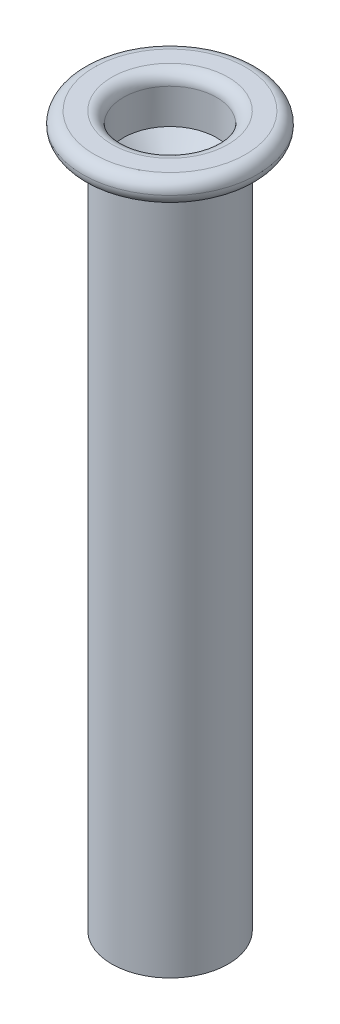
ISO-10303-21;
HEADER;
FILE_DESCRIPTION(('STEP AP214'),'2;1');
FILE_NAME('part.step','',(''),(''),'','','');
FILE_SCHEMA(('AUTOMOTIVE_DESIGN { 1 0 10303 214 1 1 1 1 }'));
ENDSEC;
DATA;
#1=APPLICATION_CONTEXT('core data for automotive mechanical design processes');
#2=APPLICATION_PROTOCOL_DEFINITION('international standard','automotive_design',2000,#1);
#3=PRODUCT_CONTEXT('',#1,'mechanical');
#4=PRODUCT('Part','Part','',(#3));
#5=PRODUCT_RELATED_PRODUCT_CATEGORY('part','',(#4));
#6=PRODUCT_DEFINITION_FORMATION('','',#4);
#7=PRODUCT_DEFINITION_CONTEXT('part definition',#1,'design');
#8=PRODUCT_DEFINITION('design','',#6,#7);
#9=PRODUCT_DEFINITION_SHAPE('','',#8);
#10=(LENGTH_UNIT() NAMED_UNIT(*) SI_UNIT(.MILLI.,.METRE.));
#11=(NAMED_UNIT(*) PLANE_ANGLE_UNIT() SI_UNIT($,.RADIAN.));
#12=(NAMED_UNIT(*) SI_UNIT($,.STERADIAN.) SOLID_ANGLE_UNIT());
#13=UNCERTAINTY_MEASURE_WITH_UNIT(LENGTH_MEASURE(1.E-05),#10,'distance_accuracy_value','');
#14=(GEOMETRIC_REPRESENTATION_CONTEXT(3) GLOBAL_UNCERTAINTY_ASSIGNED_CONTEXT((#13)) GLOBAL_UNIT_ASSIGNED_CONTEXT((#10,
#11,#12)) REPRESENTATION_CONTEXT('',''));
#15=CARTESIAN_POINT('',(0.,0.,0.));
#16=DIRECTION('',(0.,0.,1.));
#17=DIRECTION('',(1.,0.,0.));
#18=AXIS2_PLACEMENT_3D('',#15,#16,#17);
#19=CARTESIAN_POINT('',(3.36536354339501E-13,29.5000000000003,-4.44089209850063E-13));
#20=DIRECTION('',(0.,-1.,0.));
#21=DIRECTION('',(0.,0.,-0.999999999999999));
#22=AXIS2_PLACEMENT_3D('',#19,#20,#21);
#23=CYLINDRICAL_SURFACE('',#22,2.5);
#24=CARTESIAN_POINT('',(3.36536354339501E-13,29.5000000000003,-4.44089209850063E-13));
#25=DIRECTION('',(0.,1.,0.));
#26=DIRECTION('',(0.,0.,0.999999999999999));
#27=AXIS2_PLACEMENT_3D('',#24,#25,#26);
#28=CIRCLE('',#27,2.5);
#29=CARTESIAN_POINT('',(3.3431590829025E-13,29.5000000000003,2.49999999999955));
#30=VERTEX_POINT('',#29);
#31=EDGE_CURVE('E82',#30,#30,#28,.T.);
#32=ORIENTED_EDGE('',*,*,#31,.F.);
#33=EDGE_LOOP('',(#32));
#34=FACE_BOUND('',#33,.T.);
#35=CARTESIAN_POINT('',(0.,0.,0.));
#36=DIRECTION('',(0.,1.,0.));
#37=DIRECTION('',(0.,0.,0.999999999999999));
#38=AXIS2_PLACEMENT_3D('',#35,#36,#37);
#39=CIRCLE('',#38,2.5);
#40=CARTESIAN_POINT('',(0.,0.,2.5));
#41=VERTEX_POINT('',#40);
#42=EDGE_CURVE('E76',#41,#41,#39,.T.);
#43=ORIENTED_EDGE('',*,*,#42,.T.);
#44=EDGE_LOOP('',(#43));
#45=FACE_BOUND('',#44,.T.);
#46=ADVANCED_FACE('F53',(#34,#45),#23,.T.);
#47=CARTESIAN_POINT('',(0.,0.,0.));
#48=DIRECTION('',(0.,1.,0.));
#49=DIRECTION('',(0.,0.,0.999999999999999));
#50=AXIS2_PLACEMENT_3D('',#47,#48,#49);
#51=PLANE('',#50);
#52=ORIENTED_EDGE('',*,*,#42,.F.);
#53=EDGE_LOOP('',(#52));
#54=FACE_BOUND('',#53,.T.);
#55=ADVANCED_FACE('F119',(#54),#51,.F.);
#56=CARTESIAN_POINT('',(4.71844785465692E-13,30.5000000000004,-7.7715611723761E-13));
#57=DIRECTION('',(0.,1.,0.));
#58=DIRECTION('',(0.,0.,0.999999999999999));
#59=AXIS2_PLACEMENT_3D('',#56,#57,#58);
#60=PLANE('',#59);
#61=CARTESIAN_POINT('',(4.71844785465692E-13,30.5000000000004,-7.7715611723761E-13));
#62=DIRECTION('',(0.,1.,0.));
#63=DIRECTION('',(0.,0.,0.999999999999999));
#64=AXIS2_PLACEMENT_3D('',#61,#62,#63);
#65=CIRCLE('',#64,2.5);
#66=CARTESIAN_POINT('',(4.69624339416441E-13,30.5000000000004,2.49999999999922));
#67=VERTEX_POINT('',#66);
#68=EDGE_CURVE('E13',#67,#67,#65,.F.);
#69=ORIENTED_EDGE('',*,*,#68,.T.);
#70=EDGE_LOOP('',(#69));
#71=FACE_BOUND('',#70,.T.);
#72=CARTESIAN_POINT('',(4.71844785465692E-13,30.5000000000004,-7.7715611723761E-13));
#73=DIRECTION('',(0.,1.,0.));
#74=DIRECTION('',(0.,0.,0.999999999999999));
#75=AXIS2_PLACEMENT_3D('',#72,#73,#74);
#76=CIRCLE('',#75,3.25);
#77=CARTESIAN_POINT('',(4.68958205601666E-13,30.5000000000004,3.24999999999922));
#78=VERTEX_POINT('',#77);
#79=EDGE_CURVE('E62',#78,#78,#76,.T.);
#80=ORIENTED_EDGE('',*,*,#79,.T.);
#81=EDGE_LOOP('',(#80));
#82=FACE_BOUND('',#81,.T.);
#83=ADVANCED_FACE('F102',(#71,#82),#60,.T.);
#84=CARTESIAN_POINT('',(3.36536354339501E-13,29.5000000000003,-4.44089209850063E-13));
#85=DIRECTION('',(0.,1.,0.));
#86=DIRECTION('',(0.,0.,0.999999999999999));
#87=AXIS2_PLACEMENT_3D('',#84,#85,#86);
#88=PLANE('',#87);
#89=CARTESIAN_POINT('',(3.36536354339501E-13,29.5000000000003,-4.44089209850063E-13));
#90=DIRECTION('',(0.,1.,0.));
#91=DIRECTION('',(0.,0.,0.999999999999999));
#92=AXIS2_PLACEMENT_3D('',#89,#90,#91);
#93=CIRCLE('',#92,3.25);
#94=CARTESIAN_POINT('',(3.33649774475475E-13,29.5000000000003,3.24999999999955));
#95=VERTEX_POINT('',#94);
#96=EDGE_CURVE('E88',#95,#95,#93,.F.);
#97=ORIENTED_EDGE('',*,*,#96,.T.);
#98=EDGE_LOOP('',(#97));
#99=FACE_BOUND('',#98,.T.);
#100=ORIENTED_EDGE('',*,*,#31,.T.);
#101=EDGE_LOOP('',(#100));
#102=FACE_BOUND('',#101,.T.);
#103=ADVANCED_FACE('F129',(#99,#102),#88,.F.);
#104=CARTESIAN_POINT('',(5.55111512312578E-13,28.5,-2.22044604925031E-13));
#105=DIRECTION('',(0.,1.,0.));
#106=DIRECTION('',(0.,0.,0.999999999999999));
#107=AXIS2_PLACEMENT_3D('',#104,#105,#106);
#108=CYLINDRICAL_SURFACE('',#107,2.);
#109=CARTESIAN_POINT('',(6.69603261727048E-13,30.0000000000003,-7.63278329429795E-13));
#110=DIRECTION('',(0.,1.,0.));
#111=DIRECTION('',(0.,0.,0.999999999999999));
#112=AXIS2_PLACEMENT_3D('',#109,#110,#111);
#113=CIRCLE('',#112,2.);
#114=CARTESIAN_POINT('',(6.67826904887647E-13,30.0000000000003,1.99999999999923));
#115=VERTEX_POINT('',#114);
#116=EDGE_CURVE('E93',#115,#115,#113,.T.);
#117=ORIENTED_EDGE('',*,*,#116,.T.);
#118=EDGE_LOOP('',(#117));
#119=FACE_BOUND('',#118,.T.);
#120=CARTESIAN_POINT('',(5.55111512312578E-13,28.5,-2.22044604925031E-13));
#121=DIRECTION('',(0.,-1.,0.));
#122=DIRECTION('',(0.,0.,-0.999999999999999));
#123=AXIS2_PLACEMENT_3D('',#120,#121,#122);
#124=CIRCLE('',#123,2.);
#125=CARTESIAN_POINT('',(5.56887869151979E-13,28.5,-2.00000000000022));
#126=VERTEX_POINT('',#125);
#127=EDGE_CURVE('E73',#126,#126,#124,.T.);
#128=ORIENTED_EDGE('',*,*,#127,.T.);
#129=EDGE_LOOP('',(#128));
#130=FACE_BOUND('',#129,.T.);
#131=ADVANCED_FACE('F69',(#119,#130),#108,.F.);
#132=CARTESIAN_POINT('',(5.55111512312578E-13,28.5,-2.22044604925031E-13));
#133=DIRECTION('',(0.,1.,0.));
#134=DIRECTION('',(0.,0.,0.999999999999999));
#135=AXIS2_PLACEMENT_3D('',#132,#133,#134);
#136=CONICAL_SURFACE('',#135,2.,0.785398163397443);
#137=CARTESIAN_POINT('',(4.71844785465692E-13,26.5000000000002,3.33066907387547E-13));
#138=VERTEX_POINT('',#137);
#139=VERTEX_LOOP('',#138);
#140=FACE_BOUND('',#139,.T.);
#141=ORIENTED_EDGE('',*,*,#127,.F.);
#142=EDGE_LOOP('',(#141));
#143=FACE_BOUND('',#142,.T.);
#144=ADVANCED_FACE('F65',(#140,#143),#136,.F.);
#145=CARTESIAN_POINT('',(6.69603261727048E-13,30.0000000000003,-7.63278329429795E-13));
#146=DIRECTION('',(0.,1.,0.));
#147=DIRECTION('',(0.,0.,0.999999999999999));
#148=AXIS2_PLACEMENT_3D('',#145,#146,#147);
#149=TOROIDAL_SURFACE('',#148,3.25,0.5);
#150=ORIENTED_EDGE('',*,*,#79,.F.);
#151=EDGE_LOOP('',(#150));
#152=FACE_BOUND('',#151,.T.);
#153=CARTESIAN_POINT('',(6.69603261727048E-13,30.0000000000003,-7.63278329429795E-13));
#154=DIRECTION('',(0.,1.,0.));
#155=DIRECTION('',(0.,0.,0.999999999999999));
#156=AXIS2_PLACEMENT_3D('',#153,#154,#155);
#157=CIRCLE('',#156,3.75);
#158=CARTESIAN_POINT('',(6.66272592653172E-13,30.0000000000003,3.74999999999923));
#159=VERTEX_POINT('',#158);
#160=EDGE_CURVE('E57',#159,#159,#157,.F.);
#161=ORIENTED_EDGE('',*,*,#160,.F.);
#162=EDGE_LOOP('',(#161));
#163=FACE_BOUND('',#162,.T.);
#164=ADVANCED_FACE('F68',(#152,#163),#149,.T.);
#165=CARTESIAN_POINT('',(6.69603261727048E-13,30.0000000000003,-7.63278329429795E-13));
#166=DIRECTION('',(0.,1.,0.));
#167=DIRECTION('',(0.,0.,0.999999999999999));
#168=AXIS2_PLACEMENT_3D('',#165,#166,#167);
#169=TOROIDAL_SURFACE('',#168,3.25,0.5);
#170=ORIENTED_EDGE('',*,*,#96,.F.);
#171=EDGE_LOOP('',(#170));
#172=FACE_BOUND('',#171,.T.);
#173=ORIENTED_EDGE('',*,*,#160,.T.);
#174=EDGE_LOOP('',(#173));
#175=FACE_BOUND('',#174,.T.);
#176=ADVANCED_FACE('F106',(#172,#175),#169,.T.);
#177=CARTESIAN_POINT('',(6.69603261727048E-13,30.0000000000003,-7.63278329429795E-13));
#178=DIRECTION('',(0.,1.,0.));
#179=DIRECTION('',(0.,0.,0.999999999999999));
#180=AXIS2_PLACEMENT_3D('',#177,#178,#179);
#181=TOROIDAL_SURFACE('',#180,2.5,0.5);
#182=ORIENTED_EDGE('',*,*,#68,.F.);
#183=EDGE_LOOP('',(#182));
#184=FACE_BOUND('',#183,.T.);
#185=ORIENTED_EDGE('',*,*,#116,.F.);
#186=EDGE_LOOP('',(#185));
#187=FACE_BOUND('',#186,.T.);
#188=ADVANCED_FACE('F55',(#184,#187),#181,.T.);
#189=CLOSED_SHELL('',(#46,#55,#83,#103,#131,#144,#164,#176,#188));
#190=MANIFOLD_SOLID_BREP('B2',#189);
#191=ADVANCED_BREP_SHAPE_REPRESENTATION('',(#18,#190),#14);
#192=SHAPE_DEFINITION_REPRESENTATION(#9,#191);
ENDSEC;
END-ISO-10303-21;
